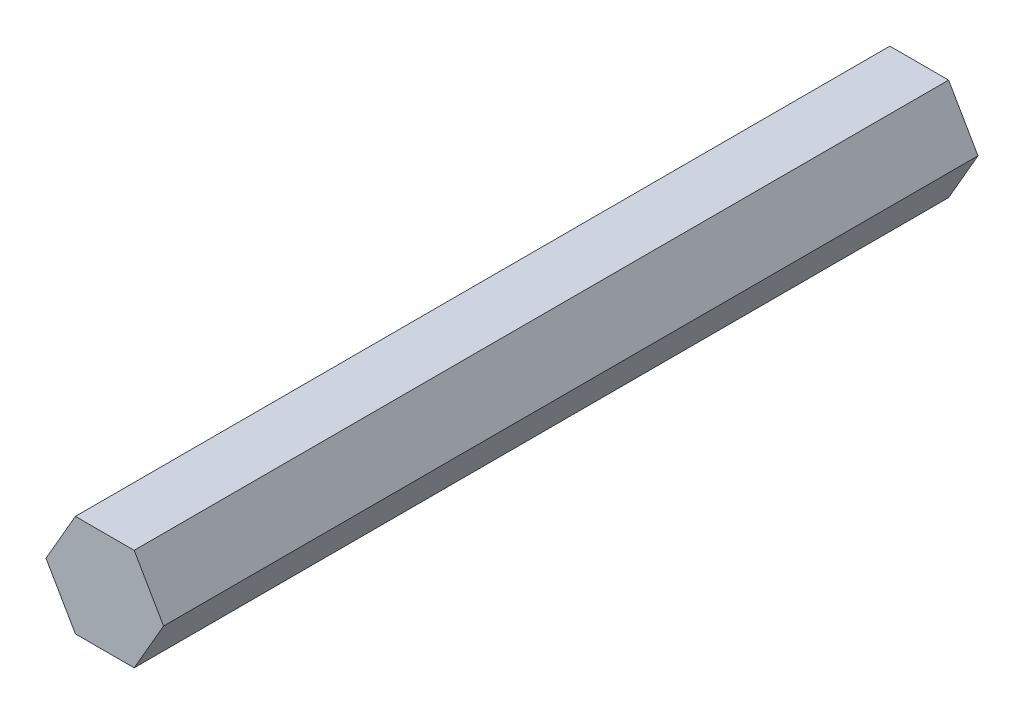
ISO-10303-21;
HEADER;
FILE_DESCRIPTION(('STEP AP214'),'2;1');
FILE_NAME('part.step','',(''),(''),'','','');
FILE_SCHEMA(('AUTOMOTIVE_DESIGN { 1 0 10303 214 1 1 1 1 }'));
ENDSEC;
DATA;
#1=APPLICATION_CONTEXT('core data for automotive mechanical design processes');
#2=APPLICATION_PROTOCOL_DEFINITION('international standard','automotive_design',2000,#1);
#3=PRODUCT_CONTEXT('',#1,'mechanical');
#4=PRODUCT('Part','Part','',(#3));
#5=PRODUCT_RELATED_PRODUCT_CATEGORY('part','',(#4));
#6=PRODUCT_DEFINITION_FORMATION('','',#4);
#7=PRODUCT_DEFINITION_CONTEXT('part definition',#1,'design');
#8=PRODUCT_DEFINITION('design','',#6,#7);
#9=PRODUCT_DEFINITION_SHAPE('','',#8);
#10=(LENGTH_UNIT() NAMED_UNIT(*) SI_UNIT(.MILLI.,.METRE.));
#11=(NAMED_UNIT(*) PLANE_ANGLE_UNIT() SI_UNIT($,.RADIAN.));
#12=(NAMED_UNIT(*) SI_UNIT($,.STERADIAN.) SOLID_ANGLE_UNIT());
#13=UNCERTAINTY_MEASURE_WITH_UNIT(LENGTH_MEASURE(1.E-05),#10,'distance_accuracy_value','');
#14=(GEOMETRIC_REPRESENTATION_CONTEXT(3) GLOBAL_UNCERTAINTY_ASSIGNED_CONTEXT((#13)) GLOBAL_UNIT_ASSIGNED_CONTEXT((#10,
#11,#12)) REPRESENTATION_CONTEXT('',''));
#15=CARTESIAN_POINT('',(0.,0.,0.));
#16=DIRECTION('',(0.,0.,1.));
#17=DIRECTION('',(1.,0.,0.));
#18=AXIS2_PLACEMENT_3D('',#15,#16,#17);
#19=CARTESIAN_POINT('',(-3.66617420935412,-6.35,50.8));
#20=DIRECTION('',(0.,1.,0.));
#21=DIRECTION('',(0.,0.,1.));
#22=AXIS2_PLACEMENT_3D('',#19,#20,#21);
#23=PLANE('',#22);
#24=DIRECTION('',(1.,0.,0.));
#25=VECTOR('',#24,1.);
#26=CARTESIAN_POINT('',(-3.66617420935412,-6.35,-50.8));
#27=LINE('',#26,#25);
#28=CARTESIAN_POINT('',(-3.66617420935412,-6.35,-50.8));
#29=VERTEX_POINT('',#28);
#30=CARTESIAN_POINT('',(3.66617420935412,-6.35,-50.8));
#31=VERTEX_POINT('',#30);
#32=EDGE_CURVE('E121',#29,#31,#27,.T.);
#33=ORIENTED_EDGE('',*,*,#32,.T.);
#34=DIRECTION('',(0.,0.,-1.));
#35=VECTOR('',#34,1.);
#36=CARTESIAN_POINT('',(3.66617420935412,-6.35,50.8));
#37=LINE('',#36,#35);
#38=CARTESIAN_POINT('',(3.66617420935412,-6.35,50.8));
#39=VERTEX_POINT('',#38);
#40=EDGE_CURVE('E11',#39,#31,#37,.T.);
#41=ORIENTED_EDGE('',*,*,#40,.F.);
#42=DIRECTION('',(1.,0.,0.));
#43=VECTOR('',#42,1.);
#44=CARTESIAN_POINT('',(-3.66617420935412,-6.35,50.8));
#45=LINE('',#44,#43);
#46=CARTESIAN_POINT('',(-3.66617420935412,-6.35,50.8));
#47=VERTEX_POINT('',#46);
#48=EDGE_CURVE('E131',#47,#39,#45,.T.);
#49=ORIENTED_EDGE('',*,*,#48,.F.);
#50=DIRECTION('',(0.,0.,-1.));
#51=VECTOR('',#50,1.);
#52=CARTESIAN_POINT('',(-3.66617420935412,-6.35,50.8));
#53=LINE('',#52,#51);
#54=EDGE_CURVE('E117',#47,#29,#53,.T.);
#55=ORIENTED_EDGE('',*,*,#54,.T.);
#56=EDGE_LOOP('',(#33,#41,#49,#55));
#57=FACE_BOUND('',#56,.T.);
#58=ADVANCED_FACE('F37',(#57),#23,.F.);
#59=CARTESIAN_POINT('',(3.66617420935412,-6.35,50.8));
#60=DIRECTION('',(-0.866025403784439,0.5,0.));
#61=DIRECTION('',(-0.5,-0.866025403784439,0.));
#62=AXIS2_PLACEMENT_3D('',#59,#60,#61);
#63=PLANE('',#62);
#64=DIRECTION('',(0.5,0.866025403784439,0.));
#65=VECTOR('',#64,1.);
#66=CARTESIAN_POINT('',(3.66617420935412,-6.35,-50.8));
#67=LINE('',#66,#65);
#68=CARTESIAN_POINT('',(7.33234841870824,0.,-50.8));
#69=VERTEX_POINT('',#68);
#70=EDGE_CURVE('E124',#31,#69,#67,.T.);
#71=ORIENTED_EDGE('',*,*,#70,.T.);
#72=DIRECTION('',(0.,0.,-1.));
#73=VECTOR('',#72,1.);
#74=CARTESIAN_POINT('',(7.33234841870824,0.,50.8));
#75=LINE('',#74,#73);
#76=CARTESIAN_POINT('',(7.33234841870824,0.,50.8));
#77=VERTEX_POINT('',#76);
#78=EDGE_CURVE('E45',#77,#69,#75,.T.);
#79=ORIENTED_EDGE('',*,*,#78,.F.);
#80=DIRECTION('',(0.5,0.866025403784439,0.));
#81=VECTOR('',#80,1.);
#82=CARTESIAN_POINT('',(3.66617420935412,-6.35,50.8));
#83=LINE('',#82,#81);
#84=EDGE_CURVE('E90',#39,#77,#83,.T.);
#85=ORIENTED_EDGE('',*,*,#84,.F.);
#86=ORIENTED_EDGE('',*,*,#40,.T.);
#87=EDGE_LOOP('',(#71,#79,#85,#86));
#88=FACE_BOUND('',#87,.T.);
#89=ADVANCED_FACE('F155',(#88),#63,.F.);
#90=CARTESIAN_POINT('',(7.33234841870824,0.,50.8));
#91=DIRECTION('',(-0.866025403784438,-0.5,0.));
#92=DIRECTION('',(0.5,-0.866025403784439,0.));
#93=AXIS2_PLACEMENT_3D('',#90,#91,#92);
#94=PLANE('',#93);
#95=DIRECTION('',(-0.5,0.866025403784438,0.));
#96=VECTOR('',#95,1.);
#97=CARTESIAN_POINT('',(7.33234841870824,0.,-50.8));
#98=LINE('',#97,#96);
#99=CARTESIAN_POINT('',(3.66617420935412,6.35,-50.8));
#100=VERTEX_POINT('',#99);
#101=EDGE_CURVE('E126',#69,#100,#98,.T.);
#102=ORIENTED_EDGE('',*,*,#101,.T.);
#103=DIRECTION('',(0.,0.,-1.));
#104=VECTOR('',#103,1.);
#105=CARTESIAN_POINT('',(3.66617420935412,6.35,50.8));
#106=LINE('',#105,#104);
#107=CARTESIAN_POINT('',(3.66617420935412,6.35,50.8));
#108=VERTEX_POINT('',#107);
#109=EDGE_CURVE('E112',#108,#100,#106,.T.);
#110=ORIENTED_EDGE('',*,*,#109,.F.);
#111=DIRECTION('',(-0.5,0.866025403784438,0.));
#112=VECTOR('',#111,1.);
#113=CARTESIAN_POINT('',(7.33234841870824,0.,50.8));
#114=LINE('',#113,#112);
#115=EDGE_CURVE('E103',#77,#108,#114,.T.);
#116=ORIENTED_EDGE('',*,*,#115,.F.);
#117=ORIENTED_EDGE('',*,*,#78,.T.);
#118=EDGE_LOOP('',(#102,#110,#116,#117));
#119=FACE_BOUND('',#118,.T.);
#120=ADVANCED_FACE('F137',(#119),#94,.F.);
#121=CARTESIAN_POINT('',(3.66617420935412,6.35,50.8));
#122=DIRECTION('',(0.,-1.,0.));
#123=DIRECTION('',(1.,0.,0.));
#124=AXIS2_PLACEMENT_3D('',#121,#122,#123);
#125=PLANE('',#124);
#126=DIRECTION('',(-1.,0.,0.));
#127=VECTOR('',#126,1.);
#128=CARTESIAN_POINT('',(3.66617420935412,6.35,-50.8));
#129=LINE('',#128,#127);
#130=CARTESIAN_POINT('',(-3.66617420935412,6.35,-50.8));
#131=VERTEX_POINT('',#130);
#132=EDGE_CURVE('E111',#100,#131,#129,.T.);
#133=ORIENTED_EDGE('',*,*,#132,.T.);
#134=DIRECTION('',(0.,0.,-1.));
#135=VECTOR('',#134,1.);
#136=CARTESIAN_POINT('',(-3.66617420935412,6.35,50.8));
#137=LINE('',#136,#135);
#138=CARTESIAN_POINT('',(-3.66617420935412,6.35,50.8));
#139=VERTEX_POINT('',#138);
#140=EDGE_CURVE('E108',#139,#131,#137,.T.);
#141=ORIENTED_EDGE('',*,*,#140,.F.);
#142=DIRECTION('',(-1.,0.,0.));
#143=VECTOR('',#142,1.);
#144=CARTESIAN_POINT('',(3.66617420935412,6.35,50.8));
#145=LINE('',#144,#143);
#146=EDGE_CURVE('E97',#108,#139,#145,.T.);
#147=ORIENTED_EDGE('',*,*,#146,.F.);
#148=ORIENTED_EDGE('',*,*,#109,.T.);
#149=EDGE_LOOP('',(#133,#141,#147,#148));
#150=FACE_BOUND('',#149,.T.);
#151=ADVANCED_FACE('F109',(#150),#125,.F.);
#152=CARTESIAN_POINT('',(-3.66617420935412,6.35,50.8));
#153=DIRECTION('',(0.866025403784439,-0.5,0.));
#154=DIRECTION('',(0.5,0.866025403784439,0.));
#155=AXIS2_PLACEMENT_3D('',#152,#153,#154);
#156=PLANE('',#155);
#157=DIRECTION('',(-0.5,-0.866025403784439,0.));
#158=VECTOR('',#157,1.);
#159=CARTESIAN_POINT('',(-3.66617420935412,6.35,-50.8));
#160=LINE('',#159,#158);
#161=CARTESIAN_POINT('',(-7.33234841870824,0.,-50.8));
#162=VERTEX_POINT('',#161);
#163=EDGE_CURVE('E76',#131,#162,#160,.T.);
#164=ORIENTED_EDGE('',*,*,#163,.T.);
#165=DIRECTION('',(0.,0.,-1.));
#166=VECTOR('',#165,1.);
#167=CARTESIAN_POINT('',(-7.33234841870824,0.,50.8));
#168=LINE('',#167,#166);
#169=CARTESIAN_POINT('',(-7.33234841870824,0.,50.8));
#170=VERTEX_POINT('',#169);
#171=EDGE_CURVE('E113',#170,#162,#168,.T.);
#172=ORIENTED_EDGE('',*,*,#171,.F.);
#173=DIRECTION('',(-0.5,-0.866025403784439,0.));
#174=VECTOR('',#173,1.);
#175=CARTESIAN_POINT('',(-3.66617420935412,6.35,50.8));
#176=LINE('',#175,#174);
#177=EDGE_CURVE('E101',#139,#170,#176,.T.);
#178=ORIENTED_EDGE('',*,*,#177,.F.);
#179=ORIENTED_EDGE('',*,*,#140,.T.);
#180=EDGE_LOOP('',(#164,#172,#178,#179));
#181=FACE_BOUND('',#180,.T.);
#182=ADVANCED_FACE('F115',(#181),#156,.F.);
#183=CARTESIAN_POINT('',(-7.33234841870824,0.,50.8));
#184=DIRECTION('',(0.866025403784438,0.5,0.));
#185=DIRECTION('',(-0.5,0.866025403784439,0.));
#186=AXIS2_PLACEMENT_3D('',#183,#184,#185);
#187=PLANE('',#186);
#188=DIRECTION('',(0.5,-0.866025403784439,0.));
#189=VECTOR('',#188,1.);
#190=CARTESIAN_POINT('',(-7.33234841870824,0.,-50.8));
#191=LINE('',#190,#189);
#192=EDGE_CURVE('E82',#162,#29,#191,.T.);
#193=ORIENTED_EDGE('',*,*,#192,.T.);
#194=ORIENTED_EDGE('',*,*,#54,.F.);
#195=DIRECTION('',(0.5,-0.866025403784439,0.));
#196=VECTOR('',#195,1.);
#197=CARTESIAN_POINT('',(-7.33234841870824,0.,50.8));
#198=LINE('',#197,#196);
#199=EDGE_CURVE('E53',#170,#47,#198,.T.);
#200=ORIENTED_EDGE('',*,*,#199,.F.);
#201=ORIENTED_EDGE('',*,*,#171,.T.);
#202=EDGE_LOOP('',(#193,#194,#200,#201));
#203=FACE_BOUND('',#202,.T.);
#204=ADVANCED_FACE('F144',(#203),#187,.F.);
#205=CARTESIAN_POINT('',(0.,0.,50.8));
#206=DIRECTION('',(0.,0.,1.));
#207=DIRECTION('',(1.,0.,0.));
#208=AXIS2_PLACEMENT_3D('',#205,#206,#207);
#209=PLANE('',#208);
#210=ORIENTED_EDGE('',*,*,#48,.T.);
#211=ORIENTED_EDGE('',*,*,#84,.T.);
#212=ORIENTED_EDGE('',*,*,#115,.T.);
#213=ORIENTED_EDGE('',*,*,#146,.T.);
#214=ORIENTED_EDGE('',*,*,#177,.T.);
#215=ORIENTED_EDGE('',*,*,#199,.T.);
#216=EDGE_LOOP('',(#210,#211,#212,#213,#214,#215));
#217=FACE_BOUND('',#216,.T.);
#218=ADVANCED_FACE('F99',(#217),#209,.T.);
#219=CARTESIAN_POINT('',(0.,0.,-50.8));
#220=DIRECTION('',(0.,0.,1.));
#221=DIRECTION('',(1.,0.,0.));
#222=AXIS2_PLACEMENT_3D('',#219,#220,#221);
#223=PLANE('',#222);
#224=ORIENTED_EDGE('',*,*,#32,.F.);
#225=ORIENTED_EDGE('',*,*,#192,.F.);
#226=ORIENTED_EDGE('',*,*,#163,.F.);
#227=ORIENTED_EDGE('',*,*,#132,.F.);
#228=ORIENTED_EDGE('',*,*,#101,.F.);
#229=ORIENTED_EDGE('',*,*,#70,.F.);
#230=EDGE_LOOP('',(#224,#225,#226,#227,#228,#229));
#231=FACE_BOUND('',#230,.T.);
#232=ADVANCED_FACE('F140',(#231),#223,.F.);
#233=CLOSED_SHELL('',(#58,#89,#120,#151,#182,#204,#218,#232));
#234=MANIFOLD_SOLID_BREP('B2',#233);
#235=ADVANCED_BREP_SHAPE_REPRESENTATION('',(#18,#234),#14);
#236=SHAPE_DEFINITION_REPRESENTATION(#9,#235);
ENDSEC;
END-ISO-10303-21;
